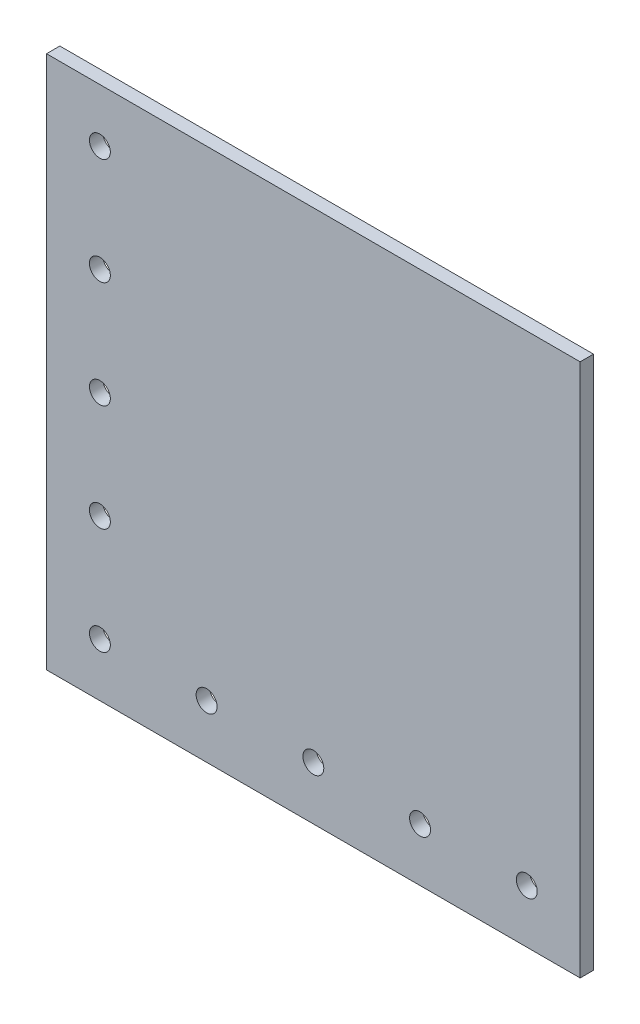
ISO-10303-21;
HEADER;
FILE_DESCRIPTION(('STEP AP214'),'2;1');
FILE_NAME('part.step','',(''),(''),'','','');
FILE_SCHEMA(('AUTOMOTIVE_DESIGN { 1 0 10303 214 1 1 1 1 }'));
ENDSEC;
DATA;
#1=APPLICATION_CONTEXT('core data for automotive mechanical design processes');
#2=APPLICATION_PROTOCOL_DEFINITION('international standard','automotive_design',2000,#1);
#3=PRODUCT_CONTEXT('',#1,'mechanical');
#4=PRODUCT('Part','Part','',(#3));
#5=PRODUCT_RELATED_PRODUCT_CATEGORY('part','',(#4));
#6=PRODUCT_DEFINITION_FORMATION('','',#4);
#7=PRODUCT_DEFINITION_CONTEXT('part definition',#1,'design');
#8=PRODUCT_DEFINITION('design','',#6,#7);
#9=PRODUCT_DEFINITION_SHAPE('','',#8);
#10=(LENGTH_UNIT() NAMED_UNIT(*) SI_UNIT(.MILLI.,.METRE.));
#11=(NAMED_UNIT(*) PLANE_ANGLE_UNIT() SI_UNIT($,.RADIAN.));
#12=(NAMED_UNIT(*) SI_UNIT($,.STERADIAN.) SOLID_ANGLE_UNIT());
#13=UNCERTAINTY_MEASURE_WITH_UNIT(LENGTH_MEASURE(1.E-05),#10,'distance_accuracy_value','');
#14=(GEOMETRIC_REPRESENTATION_CONTEXT(3) GLOBAL_UNCERTAINTY_ASSIGNED_CONTEXT((#13)) GLOBAL_UNIT_ASSIGNED_CONTEXT((#10,
#11,#12)) REPRESENTATION_CONTEXT('',''));
#15=CARTESIAN_POINT('',(0.,0.,0.));
#16=DIRECTION('',(0.,0.,1.));
#17=DIRECTION('',(1.,0.,0.));
#18=AXIS2_PLACEMENT_3D('',#15,#16,#17);
#19=CARTESIAN_POINT('',(0.,0.,1.5875));
#20=DIRECTION('',(0.,0.,-1.));
#21=DIRECTION('',(-1.,0.,0.));
#22=AXIS2_PLACEMENT_3D('',#19,#20,#21);
#23=PLANE('',#22);
#24=DIRECTION('',(-1.,0.,0.));
#25=VECTOR('',#24,1.);
#26=CARTESIAN_POINT('',(0.,127.,1.5875));
#27=LINE('',#26,#25);
#28=CARTESIAN_POINT('',(127.,127.,1.5875));
#29=VERTEX_POINT('',#28);
#30=CARTESIAN_POINT('',(0.,127.,1.5875));
#31=VERTEX_POINT('',#30);
#32=EDGE_CURVE('E97',#29,#31,#27,.T.);
#33=ORIENTED_EDGE('',*,*,#32,.T.);
#34=DIRECTION('',(0.,-1.,0.));
#35=VECTOR('',#34,1.);
#36=CARTESIAN_POINT('',(0.,127.,1.5875));
#37=LINE('',#36,#35);
#38=CARTESIAN_POINT('',(0.,0.,1.5875));
#39=VERTEX_POINT('',#38);
#40=EDGE_CURVE('E91',#31,#39,#37,.T.);
#41=ORIENTED_EDGE('',*,*,#40,.T.);
#42=DIRECTION('',(1.,0.,0.));
#43=VECTOR('',#42,1.);
#44=CARTESIAN_POINT('',(0.,0.,1.5875));
#45=LINE('',#44,#43);
#46=CARTESIAN_POINT('',(127.,0.,1.5875));
#47=VERTEX_POINT('',#46);
#48=EDGE_CURVE('E94',#39,#47,#45,.T.);
#49=ORIENTED_EDGE('',*,*,#48,.T.);
#50=DIRECTION('',(0.,1.,0.));
#51=VECTOR('',#50,1.);
#52=CARTESIAN_POINT('',(127.,0.,1.5875));
#53=LINE('',#52,#51);
#54=EDGE_CURVE('E63',#47,#29,#53,.T.);
#55=ORIENTED_EDGE('',*,*,#54,.T.);
#56=EDGE_LOOP('',(#33,#41,#49,#55));
#57=FACE_BOUND('',#56,.T.);
#58=CARTESIAN_POINT('',(114.3,12.7,1.5875));
#59=DIRECTION('',(0.,0.,1.));
#60=DIRECTION('',(1.,0.,0.));
#61=AXIS2_PLACEMENT_3D('',#58,#59,#60);
#62=CIRCLE('',#61,2.4892);
#63=CARTESIAN_POINT('',(116.7892,12.7,1.5875));
#64=VERTEX_POINT('',#63);
#65=EDGE_CURVE('E119',#64,#64,#62,.T.);
#66=ORIENTED_EDGE('',*,*,#65,.F.);
#67=EDGE_LOOP('',(#66));
#68=FACE_BOUND('',#67,.T.);
#69=CARTESIAN_POINT('',(88.9,12.6999999999998,1.5875));
#70=DIRECTION('',(0.,0.,1.));
#71=DIRECTION('',(1.,0.,0.));
#72=AXIS2_PLACEMENT_3D('',#69,#70,#71);
#73=CIRCLE('',#72,2.4892);
#74=CARTESIAN_POINT('',(91.3892,12.6999999999998,1.5875));
#75=VERTEX_POINT('',#74);
#76=EDGE_CURVE('E138',#75,#75,#73,.T.);
#77=ORIENTED_EDGE('',*,*,#76,.F.);
#78=EDGE_LOOP('',(#77));
#79=FACE_BOUND('',#78,.T.);
#80=CARTESIAN_POINT('',(63.5,12.6999999999996,1.5875));
#81=DIRECTION('',(0.,0.,1.));
#82=DIRECTION('',(1.,0.,0.));
#83=AXIS2_PLACEMENT_3D('',#80,#81,#82);
#84=CIRCLE('',#83,2.4892);
#85=CARTESIAN_POINT('',(65.9892,12.6999999999996,1.5875));
#86=VERTEX_POINT('',#85);
#87=EDGE_CURVE('E146',#86,#86,#84,.T.);
#88=ORIENTED_EDGE('',*,*,#87,.F.);
#89=EDGE_LOOP('',(#88));
#90=FACE_BOUND('',#89,.T.);
#91=CARTESIAN_POINT('',(38.1,12.6999999999995,1.5875));
#92=DIRECTION('',(0.,0.,1.));
#93=DIRECTION('',(1.,0.,0.));
#94=AXIS2_PLACEMENT_3D('',#91,#92,#93);
#95=CIRCLE('',#94,2.4892);
#96=CARTESIAN_POINT('',(40.5892,12.6999999999995,1.5875));
#97=VERTEX_POINT('',#96);
#98=EDGE_CURVE('E154',#97,#97,#95,.T.);
#99=ORIENTED_EDGE('',*,*,#98,.F.);
#100=EDGE_LOOP('',(#99));
#101=FACE_BOUND('',#100,.T.);
#102=CARTESIAN_POINT('',(12.7,12.6999999999993,1.5875));
#103=DIRECTION('',(0.,0.,1.));
#104=DIRECTION('',(1.,0.,0.));
#105=AXIS2_PLACEMENT_3D('',#102,#103,#104);
#106=CIRCLE('',#105,2.4892);
#107=CARTESIAN_POINT('',(15.1892,12.6999999999993,1.5875));
#108=VERTEX_POINT('',#107);
#109=EDGE_CURVE('E162',#108,#108,#106,.T.);
#110=ORIENTED_EDGE('',*,*,#109,.F.);
#111=EDGE_LOOP('',(#110));
#112=FACE_BOUND('',#111,.T.);
#113=CARTESIAN_POINT('',(12.6999999999999,38.0999999999993,1.5875));
#114=DIRECTION('',(0.,0.,1.));
#115=DIRECTION('',(1.,0.,0.));
#116=AXIS2_PLACEMENT_3D('',#113,#114,#115);
#117=CIRCLE('',#116,2.4892);
#118=CARTESIAN_POINT('',(15.1891999999999,38.0999999999993,1.5875));
#119=VERTEX_POINT('',#118);
#120=EDGE_CURVE('E170',#119,#119,#117,.T.);
#121=ORIENTED_EDGE('',*,*,#120,.F.);
#122=EDGE_LOOP('',(#121));
#123=FACE_BOUND('',#122,.T.);
#124=CARTESIAN_POINT('',(12.6999999999998,63.4999999999993,1.5875));
#125=DIRECTION('',(0.,0.,1.));
#126=DIRECTION('',(1.,0.,0.));
#127=AXIS2_PLACEMENT_3D('',#124,#125,#126);
#128=CIRCLE('',#127,2.4892);
#129=CARTESIAN_POINT('',(15.1891999999998,63.4999999999993,1.5875));
#130=VERTEX_POINT('',#129);
#131=EDGE_CURVE('E178',#130,#130,#128,.T.);
#132=ORIENTED_EDGE('',*,*,#131,.F.);
#133=EDGE_LOOP('',(#132));
#134=FACE_BOUND('',#133,.T.);
#135=CARTESIAN_POINT('',(12.6999999999997,88.8999999999993,1.5875));
#136=DIRECTION('',(0.,0.,1.));
#137=DIRECTION('',(1.,0.,0.));
#138=AXIS2_PLACEMENT_3D('',#135,#136,#137);
#139=CIRCLE('',#138,2.4892);
#140=CARTESIAN_POINT('',(15.1891999999997,88.8999999999993,1.5875));
#141=VERTEX_POINT('',#140);
#142=EDGE_CURVE('E186',#141,#141,#139,.T.);
#143=ORIENTED_EDGE('',*,*,#142,.F.);
#144=EDGE_LOOP('',(#143));
#145=FACE_BOUND('',#144,.T.);
#146=CARTESIAN_POINT('',(12.6999999999997,114.299999999999,1.5875));
#147=DIRECTION('',(0.,0.,1.));
#148=DIRECTION('',(1.,0.,0.));
#149=AXIS2_PLACEMENT_3D('',#146,#147,#148);
#150=CIRCLE('',#149,2.4892);
#151=CARTESIAN_POINT('',(15.1891999999997,114.299999999999,1.5875));
#152=VERTEX_POINT('',#151);
#153=EDGE_CURVE('E194',#152,#152,#150,.T.);
#154=ORIENTED_EDGE('',*,*,#153,.F.);
#155=EDGE_LOOP('',(#154));
#156=FACE_BOUND('',#155,.T.);
#157=ADVANCED_FACE('F45',(#57,#68,#79,#90,#101,#112,#123,#134,#145,#156),#23,.F.);
#158=CARTESIAN_POINT('',(0.,0.,-1.5875));
#159=DIRECTION('',(0.,0.,-1.));
#160=DIRECTION('',(-1.,0.,0.));
#161=AXIS2_PLACEMENT_3D('',#158,#159,#160);
#162=PLANE('',#161);
#163=CARTESIAN_POINT('',(12.6999999999997,88.8999999999993,-1.5875));
#164=DIRECTION('',(0.,0.,1.));
#165=DIRECTION('',(1.,0.,0.));
#166=AXIS2_PLACEMENT_3D('',#163,#164,#165);
#167=CIRCLE('',#166,2.4892);
#168=CARTESIAN_POINT('',(15.1891999999997,88.8999999999993,-1.5875));
#169=VERTEX_POINT('',#168);
#170=EDGE_CURVE('E190',#169,#169,#167,.T.);
#171=ORIENTED_EDGE('',*,*,#170,.T.);
#172=EDGE_LOOP('',(#171));
#173=FACE_BOUND('',#172,.T.);
#174=CARTESIAN_POINT('',(12.6999999999999,38.0999999999993,-1.5875));
#175=DIRECTION('',(0.,0.,1.));
#176=DIRECTION('',(1.,0.,0.));
#177=AXIS2_PLACEMENT_3D('',#174,#175,#176);
#178=CIRCLE('',#177,2.4892);
#179=CARTESIAN_POINT('',(15.1891999999999,38.0999999999993,-1.5875));
#180=VERTEX_POINT('',#179);
#181=EDGE_CURVE('E174',#180,#180,#178,.T.);
#182=ORIENTED_EDGE('',*,*,#181,.T.);
#183=EDGE_LOOP('',(#182));
#184=FACE_BOUND('',#183,.T.);
#185=CARTESIAN_POINT('',(38.1,12.6999999999995,-1.5875));
#186=DIRECTION('',(0.,0.,1.));
#187=DIRECTION('',(1.,0.,0.));
#188=AXIS2_PLACEMENT_3D('',#185,#186,#187);
#189=CIRCLE('',#188,2.4892);
#190=CARTESIAN_POINT('',(40.5892,12.6999999999995,-1.5875));
#191=VERTEX_POINT('',#190);
#192=EDGE_CURVE('E158',#191,#191,#189,.T.);
#193=ORIENTED_EDGE('',*,*,#192,.T.);
#194=EDGE_LOOP('',(#193));
#195=FACE_BOUND('',#194,.T.);
#196=CARTESIAN_POINT('',(88.9,12.6999999999998,-1.5875));
#197=DIRECTION('',(0.,0.,1.));
#198=DIRECTION('',(1.,0.,0.));
#199=AXIS2_PLACEMENT_3D('',#196,#197,#198);
#200=CIRCLE('',#199,2.4892);
#201=CARTESIAN_POINT('',(91.3892,12.6999999999998,-1.5875));
#202=VERTEX_POINT('',#201);
#203=EDGE_CURVE('E142',#202,#202,#200,.T.);
#204=ORIENTED_EDGE('',*,*,#203,.T.);
#205=EDGE_LOOP('',(#204));
#206=FACE_BOUND('',#205,.T.);
#207=DIRECTION('',(-1.,0.,0.));
#208=VECTOR('',#207,1.);
#209=CARTESIAN_POINT('',(0.,127.,-1.5875));
#210=LINE('',#209,#208);
#211=CARTESIAN_POINT('',(127.,127.,-1.5875));
#212=VERTEX_POINT('',#211);
#213=CARTESIAN_POINT('',(0.,127.,-1.5875));
#214=VERTEX_POINT('',#213);
#215=EDGE_CURVE('E115',#212,#214,#210,.T.);
#216=ORIENTED_EDGE('',*,*,#215,.F.);
#217=DIRECTION('',(0.,1.,0.));
#218=VECTOR('',#217,1.);
#219=CARTESIAN_POINT('',(127.,127.,-1.5875));
#220=LINE('',#219,#218);
#221=CARTESIAN_POINT('',(127.,0.,-1.5875));
#222=VERTEX_POINT('',#221);
#223=EDGE_CURVE('E80',#222,#212,#220,.T.);
#224=ORIENTED_EDGE('',*,*,#223,.F.);
#225=DIRECTION('',(1.,0.,0.));
#226=VECTOR('',#225,1.);
#227=CARTESIAN_POINT('',(0.,0.,-1.5875));
#228=LINE('',#227,#226);
#229=CARTESIAN_POINT('',(0.,0.,-1.5875));
#230=VERTEX_POINT('',#229);
#231=EDGE_CURVE('E122',#230,#222,#228,.T.);
#232=ORIENTED_EDGE('',*,*,#231,.F.);
#233=DIRECTION('',(0.,-1.,0.));
#234=VECTOR('',#233,1.);
#235=CARTESIAN_POINT('',(0.,127.,-1.5875));
#236=LINE('',#235,#234);
#237=EDGE_CURVE('E103',#214,#230,#236,.T.);
#238=ORIENTED_EDGE('',*,*,#237,.F.);
#239=EDGE_LOOP('',(#216,#224,#232,#238));
#240=FACE_BOUND('',#239,.T.);
#241=CARTESIAN_POINT('',(114.3,12.7,-1.5875));
#242=DIRECTION('',(0.,0.,1.));
#243=DIRECTION('',(1.,0.,0.));
#244=AXIS2_PLACEMENT_3D('',#241,#242,#243);
#245=CIRCLE('',#244,2.4892);
#246=CARTESIAN_POINT('',(116.7892,12.7,-1.5875));
#247=VERTEX_POINT('',#246);
#248=EDGE_CURVE('E134',#247,#247,#245,.T.);
#249=ORIENTED_EDGE('',*,*,#248,.T.);
#250=EDGE_LOOP('',(#249));
#251=FACE_BOUND('',#250,.T.);
#252=CARTESIAN_POINT('',(63.5,12.6999999999996,-1.5875));
#253=DIRECTION('',(0.,0.,1.));
#254=DIRECTION('',(1.,0.,0.));
#255=AXIS2_PLACEMENT_3D('',#252,#253,#254);
#256=CIRCLE('',#255,2.4892);
#257=CARTESIAN_POINT('',(65.9892,12.6999999999996,-1.5875));
#258=VERTEX_POINT('',#257);
#259=EDGE_CURVE('E150',#258,#258,#256,.T.);
#260=ORIENTED_EDGE('',*,*,#259,.T.);
#261=EDGE_LOOP('',(#260));
#262=FACE_BOUND('',#261,.T.);
#263=CARTESIAN_POINT('',(12.7,12.6999999999993,-1.5875));
#264=DIRECTION('',(0.,0.,1.));
#265=DIRECTION('',(1.,0.,0.));
#266=AXIS2_PLACEMENT_3D('',#263,#264,#265);
#267=CIRCLE('',#266,2.4892);
#268=CARTESIAN_POINT('',(15.1892,12.6999999999993,-1.5875));
#269=VERTEX_POINT('',#268);
#270=EDGE_CURVE('E166',#269,#269,#267,.T.);
#271=ORIENTED_EDGE('',*,*,#270,.T.);
#272=EDGE_LOOP('',(#271));
#273=FACE_BOUND('',#272,.T.);
#274=CARTESIAN_POINT('',(12.6999999999998,63.4999999999993,-1.5875));
#275=DIRECTION('',(0.,0.,1.));
#276=DIRECTION('',(1.,0.,0.));
#277=AXIS2_PLACEMENT_3D('',#274,#275,#276);
#278=CIRCLE('',#277,2.4892);
#279=CARTESIAN_POINT('',(15.1891999999998,63.4999999999993,-1.5875));
#280=VERTEX_POINT('',#279);
#281=EDGE_CURVE('E182',#280,#280,#278,.T.);
#282=ORIENTED_EDGE('',*,*,#281,.T.);
#283=EDGE_LOOP('',(#282));
#284=FACE_BOUND('',#283,.T.);
#285=CARTESIAN_POINT('',(12.6999999999997,114.299999999999,-1.5875));
#286=DIRECTION('',(0.,0.,1.));
#287=DIRECTION('',(1.,0.,0.));
#288=AXIS2_PLACEMENT_3D('',#285,#286,#287);
#289=CIRCLE('',#288,2.4892);
#290=CARTESIAN_POINT('',(15.1891999999997,114.299999999999,-1.5875));
#291=VERTEX_POINT('',#290);
#292=EDGE_CURVE('E198',#291,#291,#289,.T.);
#293=ORIENTED_EDGE('',*,*,#292,.T.);
#294=EDGE_LOOP('',(#293));
#295=FACE_BOUND('',#294,.T.);
#296=ADVANCED_FACE('F210',(#173,#184,#195,#206,#240,#251,#262,#273,#284,#295),#162,.T.);
#297=CARTESIAN_POINT('',(0.,127.,1.5875));
#298=DIRECTION('',(0.,-1.,0.));
#299=DIRECTION('',(0.,0.,-1.));
#300=AXIS2_PLACEMENT_3D('',#297,#298,#299);
#301=PLANE('',#300);
#302=ORIENTED_EDGE('',*,*,#215,.T.);
#303=DIRECTION('',(0.,0.,-1.));
#304=VECTOR('',#303,1.);
#305=CARTESIAN_POINT('',(0.,127.,1.5875));
#306=LINE('',#305,#304);
#307=EDGE_CURVE('E11',#31,#214,#306,.T.);
#308=ORIENTED_EDGE('',*,*,#307,.F.);
#309=ORIENTED_EDGE('',*,*,#32,.F.);
#310=DIRECTION('',(0.,0.,-1.));
#311=VECTOR('',#310,1.);
#312=CARTESIAN_POINT('',(127.,127.,1.5875));
#313=LINE('',#312,#311);
#314=EDGE_CURVE('E111',#29,#212,#313,.T.);
#315=ORIENTED_EDGE('',*,*,#314,.T.);
#316=EDGE_LOOP('',(#302,#308,#309,#315));
#317=FACE_BOUND('',#316,.T.);
#318=ADVANCED_FACE('F47',(#317),#301,.F.);
#319=CARTESIAN_POINT('',(0.,127.,1.5875));
#320=DIRECTION('',(1.,0.,0.));
#321=DIRECTION('',(0.,1.,0.));
#322=AXIS2_PLACEMENT_3D('',#319,#320,#321);
#323=PLANE('',#322);
#324=ORIENTED_EDGE('',*,*,#237,.T.);
#325=DIRECTION('',(0.,0.,-1.));
#326=VECTOR('',#325,1.);
#327=CARTESIAN_POINT('',(0.,0.,1.5875));
#328=LINE('',#327,#326);
#329=EDGE_CURVE('E55',#39,#230,#328,.T.);
#330=ORIENTED_EDGE('',*,*,#329,.F.);
#331=ORIENTED_EDGE('',*,*,#40,.F.);
#332=ORIENTED_EDGE('',*,*,#307,.T.);
#333=EDGE_LOOP('',(#324,#330,#331,#332));
#334=FACE_BOUND('',#333,.T.);
#335=ADVANCED_FACE('F102',(#334),#323,.F.);
#336=CARTESIAN_POINT('',(0.,0.,1.5875));
#337=DIRECTION('',(0.,1.,0.));
#338=DIRECTION('',(0.,0.,1.));
#339=AXIS2_PLACEMENT_3D('',#336,#337,#338);
#340=PLANE('',#339);
#341=ORIENTED_EDGE('',*,*,#231,.T.);
#342=DIRECTION('',(0.,0.,-1.));
#343=VECTOR('',#342,1.);
#344=CARTESIAN_POINT('',(127.,0.,1.5875));
#345=LINE('',#344,#343);
#346=EDGE_CURVE('E106',#47,#222,#345,.T.);
#347=ORIENTED_EDGE('',*,*,#346,.F.);
#348=ORIENTED_EDGE('',*,*,#48,.F.);
#349=ORIENTED_EDGE('',*,*,#329,.T.);
#350=EDGE_LOOP('',(#341,#347,#348,#349));
#351=FACE_BOUND('',#350,.T.);
#352=ADVANCED_FACE('F107',(#351),#340,.F.);
#353=CARTESIAN_POINT('',(127.,127.,1.5875));
#354=DIRECTION('',(-1.,0.,0.));
#355=DIRECTION('',(0.,0.,1.));
#356=AXIS2_PLACEMENT_3D('',#353,#354,#355);
#357=PLANE('',#356);
#358=ORIENTED_EDGE('',*,*,#223,.T.);
#359=ORIENTED_EDGE('',*,*,#314,.F.);
#360=ORIENTED_EDGE('',*,*,#54,.F.);
#361=ORIENTED_EDGE('',*,*,#346,.T.);
#362=EDGE_LOOP('',(#358,#359,#360,#361));
#363=FACE_BOUND('',#362,.T.);
#364=ADVANCED_FACE('F130',(#363),#357,.F.);
#365=CARTESIAN_POINT('',(114.3,12.7,1.5875));
#366=DIRECTION('',(0.,0.,-1.));
#367=DIRECTION('',(-1.,0.,0.));
#368=AXIS2_PLACEMENT_3D('',#365,#366,#367);
#369=CYLINDRICAL_SURFACE('',#368,2.4892);
#370=ORIENTED_EDGE('',*,*,#65,.T.);
#371=EDGE_LOOP('',(#370));
#372=FACE_BOUND('',#371,.T.);
#373=ORIENTED_EDGE('',*,*,#248,.F.);
#374=EDGE_LOOP('',(#373));
#375=FACE_BOUND('',#374,.T.);
#376=ADVANCED_FACE('F218',(#372,#375),#369,.F.);
#377=CARTESIAN_POINT('',(88.9,12.6999999999998,1.5875));
#378=DIRECTION('',(0.,0.,-1.));
#379=DIRECTION('',(-1.,0.,0.));
#380=AXIS2_PLACEMENT_3D('',#377,#378,#379);
#381=CYLINDRICAL_SURFACE('',#380,2.4892);
#382=ORIENTED_EDGE('',*,*,#76,.T.);
#383=EDGE_LOOP('',(#382));
#384=FACE_BOUND('',#383,.T.);
#385=ORIENTED_EDGE('',*,*,#203,.F.);
#386=EDGE_LOOP('',(#385));
#387=FACE_BOUND('',#386,.T.);
#388=ADVANCED_FACE('F264',(#384,#387),#381,.F.);
#389=CARTESIAN_POINT('',(63.5,12.6999999999996,1.5875));
#390=DIRECTION('',(0.,0.,-1.));
#391=DIRECTION('',(-1.,0.,0.));
#392=AXIS2_PLACEMENT_3D('',#389,#390,#391);
#393=CYLINDRICAL_SURFACE('',#392,2.4892);
#394=ORIENTED_EDGE('',*,*,#87,.T.);
#395=EDGE_LOOP('',(#394));
#396=FACE_BOUND('',#395,.T.);
#397=ORIENTED_EDGE('',*,*,#259,.F.);
#398=EDGE_LOOP('',(#397));
#399=FACE_BOUND('',#398,.T.);
#400=ADVANCED_FACE('F272',(#396,#399),#393,.F.);
#401=CARTESIAN_POINT('',(38.1,12.6999999999995,1.5875));
#402=DIRECTION('',(0.,0.,-1.));
#403=DIRECTION('',(-1.,0.,0.));
#404=AXIS2_PLACEMENT_3D('',#401,#402,#403);
#405=CYLINDRICAL_SURFACE('',#404,2.4892);
#406=ORIENTED_EDGE('',*,*,#98,.T.);
#407=EDGE_LOOP('',(#406));
#408=FACE_BOUND('',#407,.T.);
#409=ORIENTED_EDGE('',*,*,#192,.F.);
#410=EDGE_LOOP('',(#409));
#411=FACE_BOUND('',#410,.T.);
#412=ADVANCED_FACE('F280',(#408,#411),#405,.F.);
#413=CARTESIAN_POINT('',(12.7,12.6999999999993,1.5875));
#414=DIRECTION('',(0.,0.,-1.));
#415=DIRECTION('',(-1.,0.,0.));
#416=AXIS2_PLACEMENT_3D('',#413,#414,#415);
#417=CYLINDRICAL_SURFACE('',#416,2.4892);
#418=ORIENTED_EDGE('',*,*,#109,.T.);
#419=EDGE_LOOP('',(#418));
#420=FACE_BOUND('',#419,.T.);
#421=ORIENTED_EDGE('',*,*,#270,.F.);
#422=EDGE_LOOP('',(#421));
#423=FACE_BOUND('',#422,.T.);
#424=ADVANCED_FACE('F289',(#420,#423),#417,.F.);
#425=CARTESIAN_POINT('',(12.6999999999999,38.0999999999993,1.5875));
#426=DIRECTION('',(0.,0.,-1.));
#427=DIRECTION('',(-1.,0.,0.));
#428=AXIS2_PLACEMENT_3D('',#425,#426,#427);
#429=CYLINDRICAL_SURFACE('',#428,2.4892);
#430=ORIENTED_EDGE('',*,*,#120,.T.);
#431=EDGE_LOOP('',(#430));
#432=FACE_BOUND('',#431,.T.);
#433=ORIENTED_EDGE('',*,*,#181,.F.);
#434=EDGE_LOOP('',(#433));
#435=FACE_BOUND('',#434,.T.);
#436=ADVANCED_FACE('F298',(#432,#435),#429,.F.);
#437=CARTESIAN_POINT('',(12.6999999999998,63.4999999999993,1.5875));
#438=DIRECTION('',(0.,0.,-1.));
#439=DIRECTION('',(-1.,0.,0.));
#440=AXIS2_PLACEMENT_3D('',#437,#438,#439);
#441=CYLINDRICAL_SURFACE('',#440,2.4892);
#442=ORIENTED_EDGE('',*,*,#131,.T.);
#443=EDGE_LOOP('',(#442));
#444=FACE_BOUND('',#443,.T.);
#445=ORIENTED_EDGE('',*,*,#281,.F.);
#446=EDGE_LOOP('',(#445));
#447=FACE_BOUND('',#446,.T.);
#448=ADVANCED_FACE('F307',(#444,#447),#441,.F.);
#449=CARTESIAN_POINT('',(12.6999999999997,88.8999999999993,1.5875));
#450=DIRECTION('',(0.,0.,-1.));
#451=DIRECTION('',(-1.,0.,0.));
#452=AXIS2_PLACEMENT_3D('',#449,#450,#451);
#453=CYLINDRICAL_SURFACE('',#452,2.4892);
#454=ORIENTED_EDGE('',*,*,#142,.T.);
#455=EDGE_LOOP('',(#454));
#456=FACE_BOUND('',#455,.T.);
#457=ORIENTED_EDGE('',*,*,#170,.F.);
#458=EDGE_LOOP('',(#457));
#459=FACE_BOUND('',#458,.T.);
#460=ADVANCED_FACE('F316',(#456,#459),#453,.F.);
#461=CARTESIAN_POINT('',(12.6999999999997,114.299999999999,1.5875));
#462=DIRECTION('',(0.,0.,-1.));
#463=DIRECTION('',(-1.,0.,0.));
#464=AXIS2_PLACEMENT_3D('',#461,#462,#463);
#465=CYLINDRICAL_SURFACE('',#464,2.4892);
#466=ORIENTED_EDGE('',*,*,#153,.T.);
#467=EDGE_LOOP('',(#466));
#468=FACE_BOUND('',#467,.T.);
#469=ORIENTED_EDGE('',*,*,#292,.F.);
#470=EDGE_LOOP('',(#469));
#471=FACE_BOUND('',#470,.T.);
#472=ADVANCED_FACE('F206',(#468,#471),#465,.F.);
#473=CLOSED_SHELL('',(#157,#296,#318,#335,#352,#364,#376,#388,#400,#412,#424,#436,#448,#460,#472));
#474=MANIFOLD_SOLID_BREP('B2',#473);
#475=ADVANCED_BREP_SHAPE_REPRESENTATION('',(#18,#474),#14);
#476=SHAPE_DEFINITION_REPRESENTATION(#9,#475);
ENDSEC;
END-ISO-10303-21;
